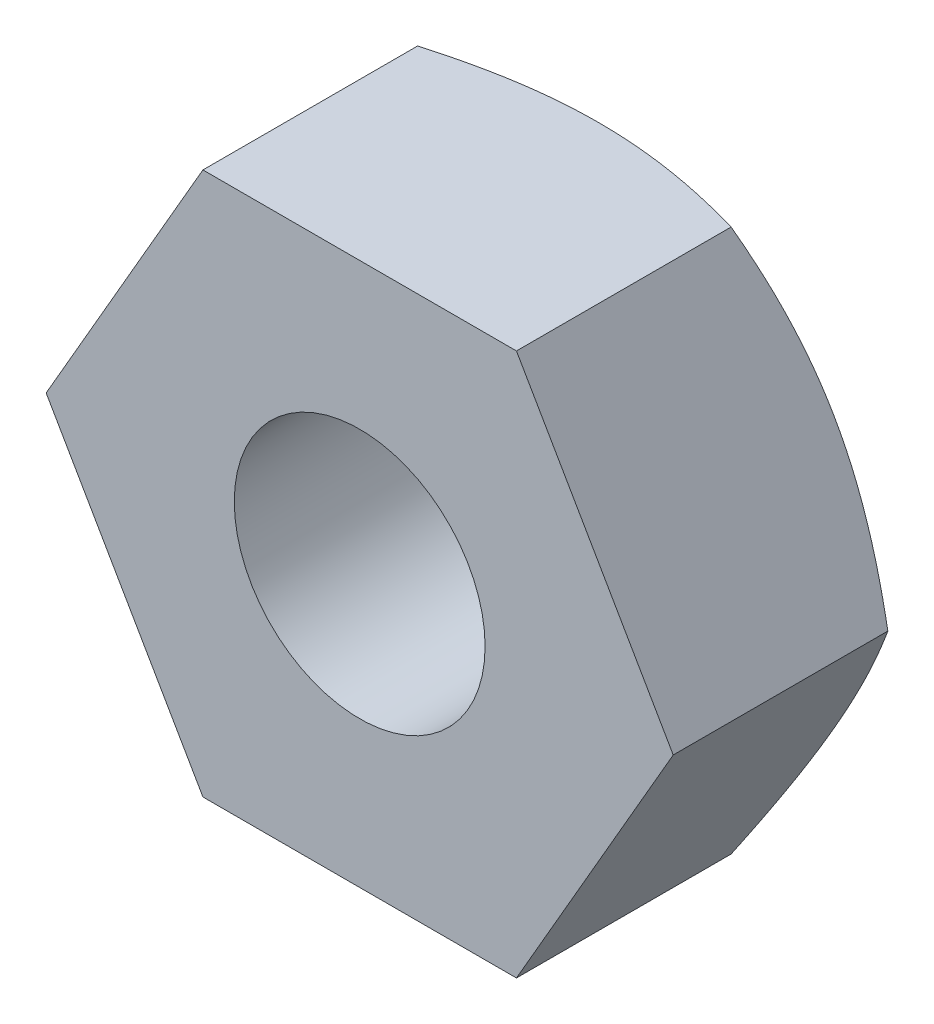
ISO-10303-21;
HEADER;
FILE_DESCRIPTION(('STEP AP214'),'2;1');
FILE_NAME('part.step','',(''),(''),'','','');
FILE_SCHEMA(('AUTOMOTIVE_DESIGN { 1 0 10303 214 1 1 1 1 }'));
ENDSEC;
DATA;
#1=APPLICATION_CONTEXT('core data for automotive mechanical design processes');
#2=APPLICATION_PROTOCOL_DEFINITION('international standard','automotive_design',2000,#1);
#3=PRODUCT_CONTEXT('',#1,'mechanical');
#4=PRODUCT('Part','Part','',(#3));
#5=PRODUCT_RELATED_PRODUCT_CATEGORY('part','',(#4));
#6=PRODUCT_DEFINITION_FORMATION('','',#4);
#7=PRODUCT_DEFINITION_CONTEXT('part definition',#1,'design');
#8=PRODUCT_DEFINITION('design','',#6,#7);
#9=PRODUCT_DEFINITION_SHAPE('','',#8);
#10=(LENGTH_UNIT() NAMED_UNIT(*) SI_UNIT(.MILLI.,.METRE.));
#11=(NAMED_UNIT(*) PLANE_ANGLE_UNIT() SI_UNIT($,.RADIAN.));
#12=(NAMED_UNIT(*) SI_UNIT($,.STERADIAN.) SOLID_ANGLE_UNIT());
#13=UNCERTAINTY_MEASURE_WITH_UNIT(LENGTH_MEASURE(1.E-05),#10,'distance_accuracy_value','');
#14=(GEOMETRIC_REPRESENTATION_CONTEXT(3) GLOBAL_UNCERTAINTY_ASSIGNED_CONTEXT((#13)) GLOBAL_UNIT_ASSIGNED_CONTEXT((#10,
#11,#12)) REPRESENTATION_CONTEXT('',''));
#15=CARTESIAN_POINT('',(0.,0.,0.));
#16=DIRECTION('',(0.,0.,1.));
#17=DIRECTION('',(1.,0.,0.));
#18=AXIS2_PLACEMENT_3D('',#15,#16,#17);
#19=CARTESIAN_POINT('',(0.,0.,0.));
#20=DIRECTION('',(0.,0.,1.));
#21=DIRECTION('',(1.,0.,0.));
#22=AXIS2_PLACEMENT_3D('',#19,#20,#21);
#23=PLANE('',#22);
#24=CARTESIAN_POINT('',(0.,0.,0.));
#25=DIRECTION('',(0.,0.,1.));
#26=DIRECTION('',(1.,0.,0.));
#27=AXIS2_PLACEMENT_3D('',#24,#25,#26);
#28=CIRCLE('',#27,2.);
#29=CARTESIAN_POINT('',(2.,0.,0.));
#30=VERTEX_POINT('',#29);
#31=EDGE_CURVE('E131',#30,#30,#28,.T.);
#32=ORIENTED_EDGE('',*,*,#31,.T.);
#33=EDGE_LOOP('',(#32));
#34=FACE_BOUND('',#33,.T.);
#35=CARTESIAN_POINT('',(0.,0.,0.));
#36=DIRECTION('',(0.,0.,-1.));
#37=DIRECTION('',(-1.,0.,0.));
#38=AXIS2_PLACEMENT_3D('',#35,#36,#37);
#39=CIRCLE('',#38,4.);
#40=CARTESIAN_POINT('',(-4.,0.,0.));
#41=VERTEX_POINT('',#40);
#42=EDGE_CURVE('E106',#41,#41,#39,.T.);
#43=ORIENTED_EDGE('',*,*,#42,.T.);
#44=EDGE_LOOP('',(#43));
#45=FACE_BOUND('',#44,.T.);
#46=ADVANCED_FACE('F33',(#34,#45),#23,.F.);
#47=CARTESIAN_POINT('',(2.50000000000005,-4.33012701892216,4.));
#48=DIRECTION('',(-0.866025403784442,0.499999999999995,0.));
#49=DIRECTION('',(-0.499999999999995,-0.866025403784442,0.));
#50=AXIS2_PLACEMENT_3D('',#47,#48,#49);
#51=PLANE('',#50);
#52=CARTESIAN_POINT('',(5.00011547005384,0.000200000000000209,0.577416938165637));
#53=CARTESIAN_POINT('',(4.89025366193521,-0.190086233472843,0.513965456572374));
#54=CARTESIAN_POINT('',(4.77944353254965,-0.382015007561932,0.456258818576725));
#55=CARTESIAN_POINT('',(4.55590451166329,-0.769195949211303,0.355531695704584));
#56=CARTESIAN_POINT('',(4.44317164842298,-0.96445499602623,0.312546843697142));
#57=CARTESIAN_POINT('',(4.21910302231792,-1.35255324082236,0.245635196410057));
#58=CARTESIAN_POINT('',(4.10780173356077,-1.54533272789764,0.221263059634955));
#59=CARTESIAN_POINT('',(3.88467549089559,-1.93179871669569,0.19216871595543));
#60=CARTESIAN_POINT('',(3.7728513478988,-2.12548381387898,0.187422415447268));
#61=CARTESIAN_POINT('',(3.56390471326909,-2.48739000112817,0.197300541931336));
#62=CARTESIAN_POINT('',(3.4667509305997,-2.65566528885906,0.209499555088048));
#63=CARTESIAN_POINT('',(3.27307631635828,-2.99111956086151,0.24816196853798));
#64=CARTESIAN_POINT('',(3.17655615458396,-3.1582973850094,0.274638573814718));
#65=CARTESIAN_POINT('',(2.98248227505805,-3.49444320477028,0.340827528264019));
#66=CARTESIAN_POINT('',(2.88495311832942,-3.66336865944361,0.380820428319264));
#67=CARTESIAN_POINT('',(2.69134936416288,-3.99870019819614,0.471588388661271));
#68=CARTESIAN_POINT('',(2.59527228669906,-4.16511057780621,0.522342123928826));
#69=CARTESIAN_POINT('',(2.49988452994621,-4.33032701892216,0.577416938165637));
#70=B_SPLINE_CURVE_WITH_KNOTS('',3,(#52,#53,#54,#55,#56,#57,#58,#59,#60,#61,#62,#63,#64,#65,#66,
#67,#68,#69),.UNSPECIFIED.,.F.,.F.,(4,2,2,2,2,2,2,2,4),(0.,0.686375611076472,1.37440098738211,
2.04539832488976,2.71557166935567,3.29908680780406,3.88314255256257,4.48015300784622,
5.07599122973501),.UNSPECIFIED.);
#71=CARTESIAN_POINT('',(5.,0.,0.577350269189623));
#72=VERTEX_POINT('',#71);
#73=CARTESIAN_POINT('',(2.50000000000005,-4.33012701892216,0.577350269189623));
#74=VERTEX_POINT('',#73);
#75=EDGE_CURVE('E54',#72,#74,#70,.T.);
#76=ORIENTED_EDGE('',*,*,#75,.F.);
#77=DIRECTION('',(0.,0.,-1.));
#78=VECTOR('',#77,1.);
#79=CARTESIAN_POINT('',(5.,0.,4.));
#80=LINE('',#79,#78);
#81=CARTESIAN_POINT('',(5.,0.,4.));
#82=VERTEX_POINT('',#81);
#83=EDGE_CURVE('E48',#82,#72,#80,.T.);
#84=ORIENTED_EDGE('',*,*,#83,.F.);
#85=DIRECTION('',(0.499999999999995,0.866025403784442,0.));
#86=VECTOR('',#85,1.);
#87=CARTESIAN_POINT('',(2.50000000000005,-4.33012701892216,4.));
#88=LINE('',#87,#86);
#89=CARTESIAN_POINT('',(2.50000000000005,-4.33012701892216,4.));
#90=VERTEX_POINT('',#89);
#91=EDGE_CURVE('E130',#90,#82,#88,.T.);
#92=ORIENTED_EDGE('',*,*,#91,.F.);
#93=DIRECTION('',(0.,0.,-1.));
#94=VECTOR('',#93,1.);
#95=CARTESIAN_POINT('',(2.50000000000005,-4.33012701892216,4.));
#96=LINE('',#95,#94);
#97=EDGE_CURVE('E109',#90,#74,#96,.T.);
#98=ORIENTED_EDGE('',*,*,#97,.T.);
#99=EDGE_LOOP('',(#76,#84,#92,#98));
#100=FACE_BOUND('',#99,.T.);
#101=ADVANCED_FACE('F35',(#100),#51,.F.);
#102=CARTESIAN_POINT('',(5.,0.,4.));
#103=DIRECTION('',(-0.866025403784438,-0.500000000000001,0.));
#104=DIRECTION('',(0.500000000000001,-0.866025403784438,0.));
#105=AXIS2_PLACEMENT_3D('',#102,#103,#104);
#106=PLANE('',#105);
#107=CARTESIAN_POINT('',(2.49988452994615,4.3303270189222,0.577416938165637));
#108=CARTESIAN_POINT('',(2.60974633806478,4.14004078544936,0.513965456572374));
#109=CARTESIAN_POINT('',(2.72055646745035,3.94811201136027,0.456258818576724));
#110=CARTESIAN_POINT('',(2.94409548833671,3.5609310697109,0.355531695704581));
#111=CARTESIAN_POINT('',(3.05682835157701,3.36567202289597,0.312546843697138));
#112=CARTESIAN_POINT('',(3.28089697768208,2.97757377809984,0.245635196410051));
#113=CARTESIAN_POINT('',(3.39219826643923,2.78479429102456,0.221263059634948));
#114=CARTESIAN_POINT('',(3.61532450910442,2.39832830222652,0.192168715955422));
#115=CARTESIAN_POINT('',(3.72714865210121,2.20464320504323,0.187422415447258));
#116=CARTESIAN_POINT('',(3.93609528673092,1.84273701779404,0.197300541931325));
#117=CARTESIAN_POINT('',(4.03324906940032,1.67446173006314,0.209499555088036));
#118=CARTESIAN_POINT('',(4.22692368364174,1.33900745806069,0.248161968537968));
#119=CARTESIAN_POINT('',(4.32344384541607,1.17182963391279,0.274638573814708));
#120=CARTESIAN_POINT('',(4.51751772494198,0.835683814151903,0.34082752826401));
#121=CARTESIAN_POINT('',(4.61504688167061,0.666758359478569,0.380820428319257));
#122=CARTESIAN_POINT('',(4.80865063583716,0.331426820726032,0.471588388661267));
#123=CARTESIAN_POINT('',(4.90472771330099,0.165016441115957,0.522342123928823));
#124=CARTESIAN_POINT('',(5.00011547005384,-0.000199999999999837,0.577416938165637));
#125=B_SPLINE_CURVE_WITH_KNOTS('',3,(#107,#108,#109,#110,#111,#112,#113,#114,#115,#116,#117,
#118,#119,#120,#121,#122,#123,#124),.UNSPECIFIED.,.F.,.F.,(4,2,2,2,2,2,2,2,4),(0.,
0.686375611076472,1.37440098738211,2.04539832488976,2.71557166935567,3.29908680780407,
3.8831425525626,4.48015300784626,5.07599122973507),.UNSPECIFIED.);
#126=CARTESIAN_POINT('',(2.49999999999999,4.3301270189222,0.577350269189623));
#127=VERTEX_POINT('',#126);
#128=EDGE_CURVE('E126',#127,#72,#125,.T.);
#129=ORIENTED_EDGE('',*,*,#128,.F.);
#130=DIRECTION('',(0.,0.,-1.));
#131=VECTOR('',#130,1.);
#132=CARTESIAN_POINT('',(2.49999999999999,4.3301270189222,4.));
#133=LINE('',#132,#131);
#134=CARTESIAN_POINT('',(2.49999999999999,4.3301270189222,4.));
#135=VERTEX_POINT('',#134);
#136=EDGE_CURVE('E118',#135,#127,#133,.T.);
#137=ORIENTED_EDGE('',*,*,#136,.F.);
#138=DIRECTION('',(-0.500000000000001,0.866025403784438,0.));
#139=VECTOR('',#138,1.);
#140=CARTESIAN_POINT('',(5.,0.,4.));
#141=LINE('',#140,#139);
#142=EDGE_CURVE('E127',#82,#135,#141,.T.);
#143=ORIENTED_EDGE('',*,*,#142,.F.);
#144=ORIENTED_EDGE('',*,*,#83,.T.);
#145=EDGE_LOOP('',(#129,#137,#143,#144));
#146=FACE_BOUND('',#145,.T.);
#147=ADVANCED_FACE('F124',(#146),#106,.F.);
#148=CARTESIAN_POINT('',(2.49999999999999,4.3301270189222,4.));
#149=DIRECTION('',(0.,-1.,0.));
#150=DIRECTION('',(1.,0.,0.));
#151=AXIS2_PLACEMENT_3D('',#148,#149,#150);
#152=PLANE('',#151);
#153=CARTESIAN_POINT('',(-6.79086448991285,4.33012701892217,2.34053944330404));
#154=CARTESIAN_POINT('',(-6.60105728281807,4.33012701892217,2.24816463738636));
#155=CARTESIAN_POINT('',(-6.41082232034345,4.33012701892217,2.1566540959668));
#156=CARTESIAN_POINT('',(-6.02926962163486,4.33012701892217,1.97584627186708));
#157=CARTESIAN_POINT('',(-5.83795172691154,4.33012701892217,1.88654932400716));
#158=CARTESIAN_POINT('',(-5.45305637966314,4.33012701892217,1.71022040478323));
#159=CARTESIAN_POINT('',(-5.25947233927842,4.33012701892217,1.6232027652126));
#160=CARTESIAN_POINT('',(-4.87079036601036,4.33012701892217,1.45263006238767));
#161=CARTESIAN_POINT('',(-4.67569250306788,4.33012701892217,1.36907484028217));
#162=CARTESIAN_POINT('',(-4.27716437210641,4.33012701892218,1.20363710129628));
#163=CARTESIAN_POINT('',(-4.07367249950604,4.33012701892218,1.12190219519963));
#164=CARTESIAN_POINT('',(-3.6643362752785,4.33012701892218,0.964437454302641));
#165=CARTESIAN_POINT('',(-3.45849166681593,4.33012701892218,0.888708282419298));
#166=CARTESIAN_POINT('',(-3.04448359926232,4.33012701892218,0.74518730749029));
#167=CARTESIAN_POINT('',(-2.83632553755508,4.33012701892218,0.677380087618323));
#168=CARTESIAN_POINT('',(-2.41702456565478,4.33012701892218,0.551828454611039));
#169=CARTESIAN_POINT('',(-2.20588259331022,4.33012701892218,0.494080952528213));
#170=CARTESIAN_POINT('',(-1.78164371731949,4.33012701892218,0.391671504857872));
#171=CARTESIAN_POINT('',(-1.56856438750967,4.33012701892219,0.346938077269352));
#172=CARTESIAN_POINT('',(-1.13967905045159,4.33012701892219,0.273044058286651));
#173=CARTESIAN_POINT('',(-0.923873338526743,4.33012701892219,0.243881794771041));
#174=CARTESIAN_POINT('',(-0.493462793658723,4.33012701892219,0.203834641754312));
#175=CARTESIAN_POINT('',(-0.278880944550066,4.33012701892219,0.192708833254146));
#176=CARTESIAN_POINT('',(0.150464279883146,4.33012701892219,0.189038677728335));
#177=CARTESIAN_POINT('',(0.365227658928641,4.33012701892219,0.196494721297389));
#178=CARTESIAN_POINT('',(0.727561506842216,4.33012701892219,0.224214972917632));
#179=CARTESIAN_POINT('',(0.875510101175253,4.33012701892219,0.239841967728237));
#180=CARTESIAN_POINT('',(1.17036732056287,4.3301270189222,0.278982257666969));
#181=CARTESIAN_POINT('',(1.31727581063951,4.3301270189222,0.30249655787451));
#182=CARTESIAN_POINT('',(1.75621557956954,4.3301270189222,0.383638807645104));
#183=CARTESIAN_POINT('',(2.04631398961005,4.3301270189222,0.451853313491727));
#184=CARTESIAN_POINT('',(2.48032177828492,4.3301270189222,0.570717116692977));
#185=CARTESIAN_POINT('',(2.62646322703677,4.3301270189222,0.613685136652574));
#186=CARTESIAN_POINT('',(2.91732723777544,4.3301270189222,0.70422371614428));
#187=CARTESIAN_POINT('',(3.06204978876846,4.3301270189222,0.751794311306709));
#188=CARTESIAN_POINT('',(3.35012142844173,4.3301270189222,0.850762971870059));
#189=CARTESIAN_POINT('',(3.49347090083095,4.3301270189222,0.902159930548643));
#190=CARTESIAN_POINT('',(3.77897071615781,4.3301270189222,1.00816259105532));
#191=CARTESIAN_POINT('',(3.92112108747012,4.3301270189222,1.06276821671092));
#192=CARTESIAN_POINT('',(4.3081332215198,4.33012701892221,1.21564694014069));
#193=CARTESIAN_POINT('',(4.55193567304269,4.33012701892221,1.31659930080828));
#194=CARTESIAN_POINT('',(5.03700568500892,4.33012701892221,1.52444207348191));
#195=CARTESIAN_POINT('',(5.27827295187472,4.33012701892221,1.63133316438226));
#196=CARTESIAN_POINT('',(5.7588657029633,4.33012701892221,1.8496266064179));
#197=CARTESIAN_POINT('',(5.99819038498988,4.33012701892221,1.96103071773284));
#198=CARTESIAN_POINT('',(6.47520157520945,4.33012701892221,2.18725533770425));
#199=CARTESIAN_POINT('',(6.71288815211205,4.33012701892221,2.30207570198003));
#200=CARTESIAN_POINT('',(7.18734020381872,4.33012701892222,2.53456763570872));
#201=CARTESIAN_POINT('',(7.42410354798891,4.33012701892222,2.65224354424082));
#202=CARTESIAN_POINT('',(7.89656769205742,4.33012701892222,2.8897116107379));
#203=CARTESIAN_POINT('',(8.13226848073121,4.33012701892222,3.00950379099312));
#204=CARTESIAN_POINT('',(8.83796936608554,4.33012701892222,3.37134533428618));
#205=CARTESIAN_POINT('',(9.30667721565674,4.33012701892222,3.61591375207946));
#206=CARTESIAN_POINT('',(10.1913894611182,4.33012701892223,4.08294240119161));
#207=CARTESIAN_POINT('',(10.6076350441227,4.33012701892223,4.30494794343047));
#208=CARTESIAN_POINT('',(11.4387552572515,4.33012701892223,4.75157226752703));
#209=CARTESIAN_POINT('',(11.8536297985535,4.33012701892223,4.97619121459069));
#210=CARTESIAN_POINT('',(12.6809295988229,4.33012701892223,5.42659781392529));
#211=CARTESIAN_POINT('',(13.093358399449,4.33012701892224,5.65237897102167));
#212=CARTESIAN_POINT('',(13.9173614521083,4.33012701892224,6.10541789993947));
#213=CARTESIAN_POINT('',(14.3289357700218,4.33012701892224,6.33267555188752));
#214=CARTESIAN_POINT('',(14.7402111062615,4.33012701892224,6.56046971255131));
#215=B_SPLINE_CURVE_WITH_KNOTS('',3,(#153,#154,#155,#156,#157,#158,#159,#160,#161,#162,#163,
#164,#165,#166,#167,#168,#169,#170,#171,#172,#173,#174,#175,#176,#177,#178,#179,#180,#181,#182,
#183,#184,#185,#186,#187,#188,#189,#190,#191,#192,#193,#194,#195,#196,#197,#198,#199,#200,#201,
#202,#203,#204,#205,#206,#207,#208,#209,#210,#211,#212,#213,#214),.UNSPECIFIED.,.F.,.F.,(4,2,2,
2,2,2,2,2,2,2,2,2,2,2,2,2,2,2,2,2,2,2,2,2,2,2,2,2,2,2,4),(0.,0.633283728443813,1.2666626677551,
1.90336277558144,2.54003364002185,3.19784013097231,3.85571913027781,4.51229572515876,
5.16867035420124,5.82136855467048,6.47399665053797,7.11783332366378,7.761683530495,
8.20778351456297,8.65394036676677,9.54669521627751,10.0036359368483,10.4605801950575,
10.9173927981755,11.37419456112,12.1657063171623,12.9573087429094,13.7492229413654,
14.5411037186546,15.3342742005587,16.1274530417488,17.7134451373151,19.1286818882899,
20.5440085946263,21.9545626627129,23.3650036075106),.UNSPECIFIED.);
#216=CARTESIAN_POINT('',(-2.50000000000002,4.33012701892218,0.577350269189623));
#217=VERTEX_POINT('',#216);
#218=EDGE_CURVE('E136',#217,#127,#215,.T.);
#219=ORIENTED_EDGE('',*,*,#218,.F.);
#220=DIRECTION('',(0.,0.,-1.));
#221=VECTOR('',#220,1.);
#222=CARTESIAN_POINT('',(-2.50000000000002,4.33012701892218,4.));
#223=LINE('',#222,#221);
#224=CARTESIAN_POINT('',(-2.50000000000002,4.33012701892218,4.));
#225=VERTEX_POINT('',#224);
#226=EDGE_CURVE('E111',#225,#217,#223,.T.);
#227=ORIENTED_EDGE('',*,*,#226,.F.);
#228=DIRECTION('',(-1.,0.,0.));
#229=VECTOR('',#228,1.);
#230=CARTESIAN_POINT('',(2.49999999999999,4.3301270189222,4.));
#231=LINE('',#230,#229);
#232=EDGE_CURVE('E208',#135,#225,#231,.T.);
#233=ORIENTED_EDGE('',*,*,#232,.F.);
#234=ORIENTED_EDGE('',*,*,#136,.T.);
#235=EDGE_LOOP('',(#219,#227,#233,#234));
#236=FACE_BOUND('',#235,.T.);
#237=ADVANCED_FACE('F176',(#236),#152,.F.);
#238=CARTESIAN_POINT('',(-2.50000000000002,4.33012701892218,4.));
#239=DIRECTION('',(0.866025403784441,-0.499999999999995,0.));
#240=DIRECTION('',(0.499999999999995,0.866025403784442,0.));
#241=AXIS2_PLACEMENT_3D('',#238,#239,#240);
#242=PLANE('',#241);
#243=CARTESIAN_POINT('',(-5.00011547005384,-0.000200000000034915,0.577416938165637));
#244=CARTESIAN_POINT('',(-4.89025366193521,0.190086233472808,0.513965456572373));
#245=CARTESIAN_POINT('',(-4.77944353254965,0.382015007561897,0.456258818576723));
#246=CARTESIAN_POINT('',(-4.55590451166329,0.769195949211268,0.35553169570458));
#247=CARTESIAN_POINT('',(-4.44317164842298,0.964454996026195,0.312546843697138));
#248=CARTESIAN_POINT('',(-4.21910302231792,1.35255324082233,0.245635196410051));
#249=CARTESIAN_POINT('',(-4.10780173356077,1.54533272789761,0.221263059634948));
#250=CARTESIAN_POINT('',(-3.88467549089559,1.93179871669565,0.192168715955422));
#251=CARTESIAN_POINT('',(-3.7728513478988,2.12548381387894,0.187422415447258));
#252=CARTESIAN_POINT('',(-3.56390471326909,2.48739000112814,0.197300541931325));
#253=CARTESIAN_POINT('',(-3.46675093059969,2.65566528885904,0.209499555088036));
#254=CARTESIAN_POINT('',(-3.27307631635827,2.99111956086149,0.248161968537968));
#255=CARTESIAN_POINT('',(-3.17655615458395,3.15829738500938,0.274638573814707));
#256=CARTESIAN_POINT('',(-2.98248227505803,3.49444320477028,0.34082752826401));
#257=CARTESIAN_POINT('',(-2.8849531183294,3.66336865944361,0.380820428319257));
#258=CARTESIAN_POINT('',(-2.69134936416286,3.99870019819615,0.471588388661267));
#259=CARTESIAN_POINT('',(-2.59527228669903,4.16511057780622,0.522342123928824));
#260=CARTESIAN_POINT('',(-2.49988452994618,4.33032701892218,0.577416938165637));
#261=B_SPLINE_CURVE_WITH_KNOTS('',3,(#243,#244,#245,#246,#247,#248,#249,#250,#251,#252,#253,
#254,#255,#256,#257,#258,#259,#260),.UNSPECIFIED.,.F.,.F.,(4,2,2,2,2,2,2,2,4),(0.,
0.686375611076472,1.37440098738212,2.04539832488976,2.71557166935567,3.29908680780407,
3.8831425525626,4.48015300784626,5.07599122973507),.UNSPECIFIED.);
#262=CARTESIAN_POINT('',(-5.,0.,0.577350269189623));
#263=VERTEX_POINT('',#262);
#264=EDGE_CURVE('E105',#263,#217,#261,.T.);
#265=ORIENTED_EDGE('',*,*,#264,.F.);
#266=DIRECTION('',(0.,0.,-1.));
#267=VECTOR('',#266,1.);
#268=CARTESIAN_POINT('',(-5.,0.,4.));
#269=LINE('',#268,#267);
#270=CARTESIAN_POINT('',(-5.,0.,4.));
#271=VERTEX_POINT('',#270);
#272=EDGE_CURVE('E104',#271,#263,#269,.T.);
#273=ORIENTED_EDGE('',*,*,#272,.F.);
#274=DIRECTION('',(-0.499999999999995,-0.866025403784441,0.));
#275=VECTOR('',#274,1.);
#276=CARTESIAN_POINT('',(-2.50000000000002,4.33012701892218,4.));
#277=LINE('',#276,#275);
#278=EDGE_CURVE('E209',#225,#271,#277,.T.);
#279=ORIENTED_EDGE('',*,*,#278,.F.);
#280=ORIENTED_EDGE('',*,*,#226,.T.);
#281=EDGE_LOOP('',(#265,#273,#279,#280));
#282=FACE_BOUND('',#281,.T.);
#283=ADVANCED_FACE('F179',(#282),#242,.F.);
#284=CARTESIAN_POINT('',(-5.,0.,4.));
#285=DIRECTION('',(0.866025403784435,0.500000000000007,0.));
#286=DIRECTION('',(-0.500000000000007,0.866025403784435,0.));
#287=AXIS2_PLACEMENT_3D('',#284,#285,#286);
#288=PLANE('',#287);
#289=CARTESIAN_POINT('',(-2.49988452994612,-4.33032701892222,0.577416938165637));
#290=CARTESIAN_POINT('',(-2.60974633806475,-4.14004078544937,0.513965456572374));
#291=CARTESIAN_POINT('',(-2.72055646745032,-3.94811201136029,0.456258818576724));
#292=CARTESIAN_POINT('',(-2.94409548833668,-3.56093106971092,0.355531695704581));
#293=CARTESIAN_POINT('',(-3.05682835157699,-3.36567202289599,0.312546843697138));
#294=CARTESIAN_POINT('',(-3.28089697768206,-2.97757377809987,0.245635196410052));
#295=CARTESIAN_POINT('',(-3.39219826643921,-2.78479429102459,0.221263059634949));
#296=CARTESIAN_POINT('',(-3.6153245091044,-2.39832830222655,0.192168715955422));
#297=CARTESIAN_POINT('',(-3.72714865210119,-2.20464320504326,0.187422415447258));
#298=CARTESIAN_POINT('',(-3.93609528673091,-1.84273701779407,0.197300541931325));
#299=CARTESIAN_POINT('',(-4.03324906940031,-1.67446173006317,0.209499555088037));
#300=CARTESIAN_POINT('',(-4.22692368364173,-1.33900745806072,0.248161968537968));
#301=CARTESIAN_POINT('',(-4.32344384541606,-1.17182963391282,0.274638573814707));
#302=CARTESIAN_POINT('',(-4.51751772494198,-0.835683814151934,0.34082752826401));
#303=CARTESIAN_POINT('',(-4.61504688167061,-0.666758359478602,0.380820428319257));
#304=CARTESIAN_POINT('',(-4.80865063583716,-0.331426820726066,0.471588388661267));
#305=CARTESIAN_POINT('',(-4.90472771330099,-0.165016441115991,0.522342123928824));
#306=CARTESIAN_POINT('',(-5.00011547005384,0.00019999999996542,0.577416938165637));
#307=B_SPLINE_CURVE_WITH_KNOTS('',3,(#289,#290,#291,#292,#293,#294,#295,#296,#297,#298,#299,
#300,#301,#302,#303,#304,#305,#306),.UNSPECIFIED.,.F.,.F.,(4,2,2,2,2,2,2,2,4),(0.,
0.686375611076471,1.37440098738211,2.04539832488976,2.71557166935567,3.29908680780407,
3.8831425525626,4.48015300784626,5.07599122973507),.UNSPECIFIED.);
#308=CARTESIAN_POINT('',(-2.50000000000024,-4.33012701892222,0.577350269189434));
#309=VERTEX_POINT('',#308);
#310=EDGE_CURVE('E92',#309,#263,#307,.T.);
#311=ORIENTED_EDGE('',*,*,#310,.F.);
#312=DIRECTION('',(0.,0.,-1.));
#313=VECTOR('',#312,1.);
#314=CARTESIAN_POINT('',(-2.49999999999996,-4.33012701892222,4.));
#315=LINE('',#314,#313);
#316=CARTESIAN_POINT('',(-2.49999999999996,-4.33012701892222,4.));
#317=VERTEX_POINT('',#316);
#318=EDGE_CURVE('E102',#317,#309,#315,.T.);
#319=ORIENTED_EDGE('',*,*,#318,.F.);
#320=DIRECTION('',(0.500000000000007,-0.866025403784435,0.));
#321=VECTOR('',#320,1.);
#322=CARTESIAN_POINT('',(-5.,0.,4.));
#323=LINE('',#322,#321);
#324=EDGE_CURVE('E211',#271,#317,#323,.T.);
#325=ORIENTED_EDGE('',*,*,#324,.F.);
#326=ORIENTED_EDGE('',*,*,#272,.T.);
#327=EDGE_LOOP('',(#311,#319,#325,#326));
#328=FACE_BOUND('',#327,.T.);
#329=ADVANCED_FACE('F100',(#328),#288,.F.);
#330=CARTESIAN_POINT('',(-2.49999999999996,-4.33012701892222,4.));
#331=DIRECTION('',(0.,1.,0.));
#332=DIRECTION('',(-1.,0.,0.));
#333=AXIS2_PLACEMENT_3D('',#330,#331,#332);
#334=PLANE('',#333);
#335=CARTESIAN_POINT('',(-6.79086449204143,-4.33012701892226,2.34053944434028));
#336=CARTESIAN_POINT('',(-6.60105728487499,-4.33012701892226,2.24816463837936));
#337=CARTESIAN_POINT('',(-6.41082232232866,-4.33012701892226,2.15665409691658));
#338=CARTESIAN_POINT('',(-6.02926962347643,-4.33012701892225,1.97584627273063));
#339=CARTESIAN_POINT('',(-5.83795172868118,-4.33012701892225,1.8865493248277));
#340=CARTESIAN_POINT('',(-5.45305638128782,-4.33012701892225,1.71022040551773));
#341=CARTESIAN_POINT('',(-5.25947234083007,-4.33012701892225,1.62320276590407));
#342=CARTESIAN_POINT('',(-4.87079036741545,-4.33012701892224,1.4526300629938));
#343=CARTESIAN_POINT('',(-4.67569250439944,-4.33012701892224,1.36907484084598));
#344=CARTESIAN_POINT('',(-4.27716437328527,-4.33012701892223,1.20363710177427));
#345=CARTESIAN_POINT('',(-4.07367250060566,-4.33012701892223,1.1219021956342));
#346=CARTESIAN_POINT('',(-3.66433627621838,-4.33012701892223,0.964437454652677));
#347=CARTESIAN_POINT('',(-3.4584916676753,-4.33012701892223,0.888708282728225));
#348=CARTESIAN_POINT('',(-3.04448359995919,-4.33012701892222,0.745187307720919));
#349=CARTESIAN_POINT('',(-2.83632553816996,-4.33012701892222,0.677380087811751));
#350=CARTESIAN_POINT('',(-2.41702456610345,-4.33012701892222,0.551828454736115));
#351=CARTESIAN_POINT('',(-2.20588259367467,-4.33012701892221,0.494080952622134));
#352=CARTESIAN_POINT('',(-1.78164371747236,-4.33012701892221,0.3916715048889));
#353=CARTESIAN_POINT('',(-1.56856438753459,-4.33012701892221,0.346938077271038));
#354=CARTESIAN_POINT('',(-1.1396790502175,-4.3301270189222,0.273044058248942));
#355=CARTESIAN_POINT('',(-0.923873338161612,-4.3301270189222,0.243881794723264));
#356=CARTESIAN_POINT('',(-0.493462793033644,-4.3301270189222,0.203834641709764));
#357=CARTESIAN_POINT('',(-0.278880943796114,-4.33012701892219,0.192708833222464));
#358=CARTESIAN_POINT('',(0.15046428089289,-4.33012701892219,0.18903867774492));
#359=CARTESIAN_POINT('',(0.365227660065305,-4.33012701892219,0.196494721349379));
#360=CARTESIAN_POINT('',(0.72756150813807,-4.33012701892218,0.224214973041096));
#361=CARTESIAN_POINT('',(0.875510102504816,-4.33012701892218,0.239841967880018));
#362=CARTESIAN_POINT('',(1.17036732195834,-4.33012701892218,0.278982257876887));
#363=CARTESIAN_POINT('',(1.31727581206717,-4.33012701892218,0.302496558114248));
#364=CARTESIAN_POINT('',(1.75621558109203,-4.33012701892217,0.383638807974924));
#365=CARTESIAN_POINT('',(2.04631399119326,-4.33012701892217,0.451853313882393));
#366=CARTESIAN_POINT('',(2.48032177995896,-4.33012701892216,0.570717117173428));
#367=CARTESIAN_POINT('',(2.62646322874175,-4.33012701892216,0.613685137163165));
#368=CARTESIAN_POINT('',(2.91732723954195,-4.33012701892216,0.704223716714227));
#369=CARTESIAN_POINT('',(3.06204979056556,-4.33012701892216,0.751794311905872));
#370=CARTESIAN_POINT('',(3.35012143029978,-4.33012701892216,0.850762972526604));
#371=CARTESIAN_POINT('',(3.49347090271935,-4.33012701892215,0.902159931233352));
#372=CARTESIAN_POINT('',(3.77897071810694,-4.33012701892215,1.00816259179537));
#373=CARTESIAN_POINT('',(3.92112108944961,-4.33012701892215,1.06276821747816));
#374=CARTESIAN_POINT('',(4.30813322351619,-4.33012701892215,1.21564694095484));
#375=CARTESIAN_POINT('',(4.55193567502655,-4.33012701892214,1.31659930163907));
#376=CARTESIAN_POINT('',(5.03700568696933,-4.33012701892214,1.52444207434106));
#377=CARTESIAN_POINT('',(5.27827295382423,-4.33012701892214,1.63133316525312));
#378=CARTESIAN_POINT('',(5.75886570489217,-4.33012701892213,1.84962660730861));
#379=CARTESIAN_POINT('',(5.99819038690901,-4.33012701892213,1.9610307186317));
#380=CARTESIAN_POINT('',(6.47520157711015,-4.33012701892212,2.1872553386169));
#381=CARTESIAN_POINT('',(6.71288815400406,-4.33012701892212,2.30207570289832));
#382=CARTESIAN_POINT('',(7.18734020569359,-4.33012701892212,2.53456763663623));
#383=CARTESIAN_POINT('',(7.42410354985533,-4.33012701892211,2.6522435451719));
#384=CARTESIAN_POINT('',(7.89656769390757,-4.33012701892211,2.88971161167474));
#385=CARTESIAN_POINT('',(8.13226848257353,-4.33012701892211,3.00950379193217));
#386=CARTESIAN_POINT('',(8.83796936790529,-4.3301270189221,3.37134533523043));
#387=CARTESIAN_POINT('',(9.30667721746245,-4.33012701892209,3.6159137530252));
#388=CARTESIAN_POINT('',(10.1913894629104,-4.33012701892208,4.08294240214426));
#389=CARTESIAN_POINT('',(10.6076350459153,-4.33012701892208,4.30494794438888));
#390=CARTESIAN_POINT('',(11.4387552590454,-4.33012701892207,4.75157226849584));
#391=CARTESIAN_POINT('',(11.8536298003483,-4.33012701892207,4.97619121556413));
#392=CARTESIAN_POINT('',(12.6809296006218,-4.33012701892206,5.42659781490828));
#393=CARTESIAN_POINT('',(13.0933584012511,-4.33012701892205,5.6523789720096));
#394=CARTESIAN_POINT('',(13.9173614539172,-4.33012701892205,6.10541790093677));
#395=CARTESIAN_POINT('',(14.3289357718343,-4.33012701892204,6.33267555288925));
#396=CARTESIAN_POINT('',(14.7402111080777,-4.33012701892204,6.56046971355731));
#397=B_SPLINE_CURVE_WITH_KNOTS('',3,(#335,#336,#337,#338,#339,#340,#341,#342,#343,#344,#345,
#346,#347,#348,#349,#350,#351,#352,#353,#354,#355,#356,#357,#358,#359,#360,#361,#362,#363,#364,
#365,#366,#367,#368,#369,#370,#371,#372,#373,#374,#375,#376,#377,#378,#379,#380,#381,#382,#383,
#384,#385,#386,#387,#388,#389,#390,#391,#392,#393,#394,#395,#396),.UNSPECIFIED.,.F.,.F.,(4,2,2,
2,2,2,2,2,2,2,2,2,2,2,2,2,2,2,2,2,2,2,2,2,2,2,2,2,2,2,4),(0.,0.63328372869389,1.26666266825529,
1.90336277633439,2.54003364102753,3.19784013224709,3.85571913182178,4.51229572697105,
5.16867035628162,5.82136855714377,6.4739966534036,7.11783332691202,7.76168353412604,
8.20778351830349,8.65394037061677,9.54669522034693,10.0036359410323,10.4605801993561,
10.9173928025884,11.3741945656472,12.1657063216741,12.9573087474056,13.7492229458454,
14.5411037231185,15.3342742050047,16.1274530461769,17.713445141708,19.128681892692,
20.5440085990373,21.9545626671395,23.365003611953),.UNSPECIFIED.);
#398=EDGE_CURVE('E12',#74,#309,#397,.F.);
#399=ORIENTED_EDGE('',*,*,#398,.F.);
#400=ORIENTED_EDGE('',*,*,#97,.F.);
#401=DIRECTION('',(1.,0.,0.));
#402=VECTOR('',#401,1.);
#403=CARTESIAN_POINT('',(-2.49999999999996,-4.33012701892222,4.));
#404=LINE('',#403,#402);
#405=EDGE_CURVE('E62',#317,#90,#404,.T.);
#406=ORIENTED_EDGE('',*,*,#405,.F.);
#407=ORIENTED_EDGE('',*,*,#318,.T.);
#408=EDGE_LOOP('',(#399,#400,#406,#407));
#409=FACE_BOUND('',#408,.T.);
#410=ADVANCED_FACE('F108',(#409),#334,.F.);
#411=CARTESIAN_POINT('',(0.,0.,4.));
#412=DIRECTION('',(0.,0.,1.));
#413=DIRECTION('',(1.,0.,0.));
#414=AXIS2_PLACEMENT_3D('',#411,#412,#413);
#415=PLANE('',#414);
#416=ORIENTED_EDGE('',*,*,#91,.T.);
#417=ORIENTED_EDGE('',*,*,#142,.T.);
#418=ORIENTED_EDGE('',*,*,#232,.T.);
#419=ORIENTED_EDGE('',*,*,#278,.T.);
#420=ORIENTED_EDGE('',*,*,#324,.T.);
#421=ORIENTED_EDGE('',*,*,#405,.T.);
#422=EDGE_LOOP('',(#416,#417,#418,#419,#420,#421));
#423=FACE_BOUND('',#422,.T.);
#424=CARTESIAN_POINT('',(0.,0.,4.));
#425=DIRECTION('',(0.,0.,1.));
#426=DIRECTION('',(1.,0.,0.));
#427=AXIS2_PLACEMENT_3D('',#424,#425,#426);
#428=CIRCLE('',#427,2.);
#429=CARTESIAN_POINT('',(2.,0.,4.));
#430=VERTEX_POINT('',#429);
#431=EDGE_CURVE('E134',#430,#430,#428,.T.);
#432=ORIENTED_EDGE('',*,*,#431,.F.);
#433=EDGE_LOOP('',(#432));
#434=FACE_BOUND('',#433,.T.);
#435=ADVANCED_FACE('F193',(#423,#434),#415,.T.);
#436=CARTESIAN_POINT('',(0.,0.,4.));
#437=DIRECTION('',(0.,0.,-1.));
#438=DIRECTION('',(-1.,0.,0.));
#439=AXIS2_PLACEMENT_3D('',#436,#437,#438);
#440=CYLINDRICAL_SURFACE('',#439,2.);
#441=ORIENTED_EDGE('',*,*,#431,.T.);
#442=EDGE_LOOP('',(#441));
#443=FACE_BOUND('',#442,.T.);
#444=ORIENTED_EDGE('',*,*,#31,.F.);
#445=EDGE_LOOP('',(#444));
#446=FACE_BOUND('',#445,.T.);
#447=ADVANCED_FACE('F151',(#443,#446),#440,.F.);
#448=CARTESIAN_POINT('',(0.,0.,0.));
#449=DIRECTION('',(0.,0.,1.));
#450=DIRECTION('',(-1.,0.,0.));
#451=AXIS2_PLACEMENT_3D('',#448,#449,#450);
#452=CONICAL_SURFACE('',#451,4.,1.0471975511966);
#453=ORIENTED_EDGE('',*,*,#42,.F.);
#454=EDGE_LOOP('',(#453));
#455=FACE_BOUND('',#454,.T.);
#456=ORIENTED_EDGE('',*,*,#75,.T.);
#457=ORIENTED_EDGE('',*,*,#398,.T.);
#458=ORIENTED_EDGE('',*,*,#310,.T.);
#459=ORIENTED_EDGE('',*,*,#264,.T.);
#460=ORIENTED_EDGE('',*,*,#218,.T.);
#461=ORIENTED_EDGE('',*,*,#128,.T.);
#462=EDGE_LOOP('',(#456,#457,#458,#459,#460,#461));
#463=FACE_BOUND('',#462,.T.);
#464=ADVANCED_FACE('F91',(#455,#463),#452,.T.);
#465=CLOSED_SHELL('',(#46,#101,#147,#237,#283,#329,#410,#435,#447,#464));
#466=MANIFOLD_SOLID_BREP('B2',#465);
#467=ADVANCED_BREP_SHAPE_REPRESENTATION('',(#18,#466),#14);
#468=SHAPE_DEFINITION_REPRESENTATION(#9,#467);
ENDSEC;
END-ISO-10303-21;
